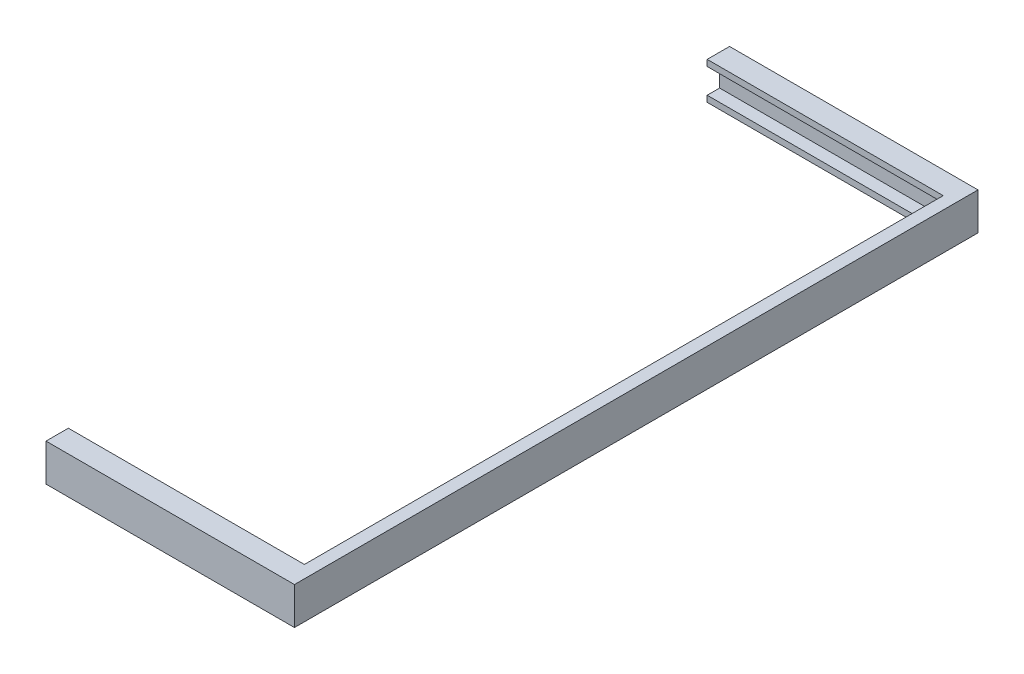
ISO-10303-21;
HEADER;
FILE_DESCRIPTION(('STEP AP214'),'2;1');
FILE_NAME('part.step','',(''),(''),'','','');
FILE_SCHEMA(('AUTOMOTIVE_DESIGN { 1 0 10303 214 1 1 1 1 }'));
ENDSEC;
DATA;
#1=APPLICATION_CONTEXT('core data for automotive mechanical design processes');
#2=APPLICATION_PROTOCOL_DEFINITION('international standard','automotive_design',2000,#1);
#3=PRODUCT_CONTEXT('',#1,'mechanical');
#4=PRODUCT('Part','Part','',(#3));
#5=PRODUCT_RELATED_PRODUCT_CATEGORY('part','',(#4));
#6=PRODUCT_DEFINITION_FORMATION('','',#4);
#7=PRODUCT_DEFINITION_CONTEXT('part definition',#1,'design');
#8=PRODUCT_DEFINITION('design','',#6,#7);
#9=PRODUCT_DEFINITION_SHAPE('','',#8);
#10=(LENGTH_UNIT() NAMED_UNIT(*) SI_UNIT(.MILLI.,.METRE.));
#11=(NAMED_UNIT(*) PLANE_ANGLE_UNIT() SI_UNIT($,.RADIAN.));
#12=(NAMED_UNIT(*) SI_UNIT($,.STERADIAN.) SOLID_ANGLE_UNIT());
#13=UNCERTAINTY_MEASURE_WITH_UNIT(LENGTH_MEASURE(1.E-05),#10,'distance_accuracy_value','');
#14=(GEOMETRIC_REPRESENTATION_CONTEXT(3) GLOBAL_UNCERTAINTY_ASSIGNED_CONTEXT((#13)) GLOBAL_UNIT_ASSIGNED_CONTEXT((#10,
#11,#12)) REPRESENTATION_CONTEXT('',''));
#15=CARTESIAN_POINT('',(0.,0.,0.));
#16=DIRECTION('',(0.,0.,1.));
#17=DIRECTION('',(1.,0.,0.));
#18=AXIS2_PLACEMENT_3D('',#15,#16,#17);
#19=CARTESIAN_POINT('',(95.,15.,271.12));
#20=DIRECTION('',(1.,0.,0.));
#21=DIRECTION('',(0.,0.,-1.));
#22=AXIS2_PLACEMENT_3D('',#19,#20,#21);
#23=PLANE('',#22);
#24=DIRECTION('',(0.,0.,-1.));
#25=VECTOR('',#24,1.);
#26=CARTESIAN_POINT('',(95.,2.5,271.12));
#27=LINE('',#26,#25);
#28=CARTESIAN_POINT('',(95.,2.5,271.12));
#29=VERTEX_POINT('',#28);
#30=CARTESIAN_POINT('',(95.,2.5,266.12));
#31=VERTEX_POINT('',#30);
#32=EDGE_CURVE('E187',#29,#31,#27,.T.);
#33=ORIENTED_EDGE('',*,*,#32,.F.);
#34=DIRECTION('',(0.,-1.,0.));
#35=VECTOR('',#34,1.);
#36=CARTESIAN_POINT('',(95.,15.,271.12));
#37=LINE('',#36,#35);
#38=CARTESIAN_POINT('',(95.,12.5,271.12));
#39=VERTEX_POINT('',#38);
#40=EDGE_CURVE('E234',#39,#29,#37,.T.);
#41=ORIENTED_EDGE('',*,*,#40,.F.);
#42=DIRECTION('',(0.,0.,-1.));
#43=VECTOR('',#42,1.);
#44=CARTESIAN_POINT('',(95.,12.5,271.12));
#45=LINE('',#44,#43);
#46=CARTESIAN_POINT('',(95.,12.5,266.12));
#47=VERTEX_POINT('',#46);
#48=EDGE_CURVE('E213',#39,#47,#45,.T.);
#49=ORIENTED_EDGE('',*,*,#48,.T.);
#50=DIRECTION('',(0.,1.,0.));
#51=VECTOR('',#50,1.);
#52=CARTESIAN_POINT('',(95.,15.,266.12));
#53=LINE('',#52,#51);
#54=CARTESIAN_POINT('',(95.,15.,266.12));
#55=VERTEX_POINT('',#54);
#56=EDGE_CURVE('E50',#47,#55,#53,.T.);
#57=ORIENTED_EDGE('',*,*,#56,.T.);
#58=DIRECTION('',(0.,0.,-1.));
#59=VECTOR('',#58,1.);
#60=CARTESIAN_POINT('',(95.,15.,271.12));
#61=LINE('',#60,#59);
#62=CARTESIAN_POINT('',(95.,15.,9.));
#63=VERTEX_POINT('',#62);
#64=EDGE_CURVE('E243',#55,#63,#61,.T.);
#65=ORIENTED_EDGE('',*,*,#64,.T.);
#66=DIRECTION('',(0.,1.,0.));
#67=VECTOR('',#66,1.);
#68=CARTESIAN_POINT('',(95.,0.,9.));
#69=LINE('',#68,#67);
#70=CARTESIAN_POINT('',(95.,12.5,9.));
#71=VERTEX_POINT('',#70);
#72=EDGE_CURVE('E249',#71,#63,#69,.T.);
#73=ORIENTED_EDGE('',*,*,#72,.F.);
#74=DIRECTION('',(0.,0.,-1.));
#75=VECTOR('',#74,1.);
#76=CARTESIAN_POINT('',(95.,12.5,9.));
#77=LINE('',#76,#75);
#78=CARTESIAN_POINT('',(95.,12.5,4.));
#79=VERTEX_POINT('',#78);
#80=EDGE_CURVE('E253',#71,#79,#77,.T.);
#81=ORIENTED_EDGE('',*,*,#80,.T.);
#82=DIRECTION('',(0.,-1.,0.));
#83=VECTOR('',#82,1.);
#84=CARTESIAN_POINT('',(95.,15.,4.));
#85=LINE('',#84,#83);
#86=CARTESIAN_POINT('',(95.,2.5,4.));
#87=VERTEX_POINT('',#86);
#88=EDGE_CURVE('E65',#79,#87,#85,.T.);
#89=ORIENTED_EDGE('',*,*,#88,.T.);
#90=DIRECTION('',(0.,0.,-1.));
#91=VECTOR('',#90,1.);
#92=CARTESIAN_POINT('',(95.,2.5,9.));
#93=LINE('',#92,#91);
#94=CARTESIAN_POINT('',(95.,2.5,9.));
#95=VERTEX_POINT('',#94);
#96=EDGE_CURVE('E246',#95,#87,#93,.T.);
#97=ORIENTED_EDGE('',*,*,#96,.F.);
#98=DIRECTION('',(0.,1.,0.));
#99=VECTOR('',#98,1.);
#100=CARTESIAN_POINT('',(95.,0.,9.));
#101=LINE('',#100,#99);
#102=CARTESIAN_POINT('',(95.,0.,9.));
#103=VERTEX_POINT('',#102);
#104=EDGE_CURVE('E325',#103,#95,#101,.T.);
#105=ORIENTED_EDGE('',*,*,#104,.F.);
#106=DIRECTION('',(0.,0.,-1.));
#107=VECTOR('',#106,1.);
#108=CARTESIAN_POINT('',(95.,0.,271.12));
#109=LINE('',#108,#107);
#110=CARTESIAN_POINT('',(95.,0.,266.12));
#111=VERTEX_POINT('',#110);
#112=EDGE_CURVE('E238',#111,#103,#109,.T.);
#113=ORIENTED_EDGE('',*,*,#112,.F.);
#114=DIRECTION('',(0.,1.,0.));
#115=VECTOR('',#114,1.);
#116=CARTESIAN_POINT('',(95.,15.,266.12));
#117=LINE('',#116,#115);
#118=EDGE_CURVE('E11',#111,#31,#117,.T.);
#119=ORIENTED_EDGE('',*,*,#118,.T.);
#120=EDGE_LOOP('',(#33,#41,#49,#57,#65,#73,#81,#89,#97,#105,#113,#119));
#121=FACE_BOUND('',#120,.T.);
#122=ADVANCED_FACE('F41',(#121),#23,.F.);
#123=CARTESIAN_POINT('',(0.,0.,271.12));
#124=DIRECTION('',(0.,0.,1.));
#125=DIRECTION('',(-1.,0.,0.));
#126=AXIS2_PLACEMENT_3D('',#123,#124,#125);
#127=PLANE('',#126);
#128=DIRECTION('',(1.,0.,0.));
#129=VECTOR('',#128,1.);
#130=CARTESIAN_POINT('',(0.,2.5,271.12));
#131=LINE('',#130,#129);
#132=CARTESIAN_POINT('',(0.,2.5,271.12));
#133=VERTEX_POINT('',#132);
#134=EDGE_CURVE('E191',#133,#29,#131,.T.);
#135=ORIENTED_EDGE('',*,*,#134,.F.);
#136=DIRECTION('',(0.,-1.,0.));
#137=VECTOR('',#136,1.);
#138=CARTESIAN_POINT('',(0.,0.,271.12));
#139=LINE('',#138,#137);
#140=CARTESIAN_POINT('',(0.,12.5,271.12));
#141=VERTEX_POINT('',#140);
#142=EDGE_CURVE('E170',#141,#133,#139,.T.);
#143=ORIENTED_EDGE('',*,*,#142,.F.);
#144=DIRECTION('',(1.,0.,0.));
#145=VECTOR('',#144,1.);
#146=CARTESIAN_POINT('',(0.,12.5,271.12));
#147=LINE('',#146,#145);
#148=EDGE_CURVE('E57',#141,#39,#147,.T.);
#149=ORIENTED_EDGE('',*,*,#148,.T.);
#150=ORIENTED_EDGE('',*,*,#40,.T.);
#151=EDGE_LOOP('',(#135,#143,#149,#150));
#152=FACE_BOUND('',#151,.T.);
#153=ADVANCED_FACE('F376',(#152),#127,.F.);
#154=CARTESIAN_POINT('',(0.,0.,4.));
#155=DIRECTION('',(0.,0.,-1.));
#156=DIRECTION('',(-1.,0.,0.));
#157=AXIS2_PLACEMENT_3D('',#154,#155,#156);
#158=PLANE('',#157);
#159=ORIENTED_EDGE('',*,*,#88,.F.);
#160=DIRECTION('',(1.,0.,0.));
#161=VECTOR('',#160,1.);
#162=CARTESIAN_POINT('',(0.,12.5,4.));
#163=LINE('',#162,#161);
#164=CARTESIAN_POINT('',(0.,12.5,4.));
#165=VERTEX_POINT('',#164);
#166=EDGE_CURVE('E276',#165,#79,#163,.T.);
#167=ORIENTED_EDGE('',*,*,#166,.F.);
#168=DIRECTION('',(0.,-1.,0.));
#169=VECTOR('',#168,1.);
#170=CARTESIAN_POINT('',(0.,0.,4.));
#171=LINE('',#170,#169);
#172=CARTESIAN_POINT('',(0.,2.5,4.));
#173=VERTEX_POINT('',#172);
#174=EDGE_CURVE('E295',#165,#173,#171,.T.);
#175=ORIENTED_EDGE('',*,*,#174,.T.);
#176=DIRECTION('',(1.,0.,0.));
#177=VECTOR('',#176,1.);
#178=CARTESIAN_POINT('',(0.,2.5,4.));
#179=LINE('',#178,#177);
#180=EDGE_CURVE('E257',#173,#87,#179,.T.);
#181=ORIENTED_EDGE('',*,*,#180,.T.);
#182=EDGE_LOOP('',(#159,#167,#175,#181));
#183=FACE_BOUND('',#182,.T.);
#184=ADVANCED_FACE('F349',(#183),#158,.F.);
#185=CARTESIAN_POINT('',(0.,12.5,9.));
#186=DIRECTION('',(0.,1.,0.));
#187=DIRECTION('',(0.,0.,1.));
#188=AXIS2_PLACEMENT_3D('',#185,#186,#187);
#189=PLANE('',#188);
#190=ORIENTED_EDGE('',*,*,#80,.F.);
#191=DIRECTION('',(1.,0.,0.));
#192=VECTOR('',#191,1.);
#193=CARTESIAN_POINT('',(0.,12.5,9.));
#194=LINE('',#193,#192);
#195=CARTESIAN_POINT('',(0.,12.5,9.));
#196=VERTEX_POINT('',#195);
#197=EDGE_CURVE('E281',#196,#71,#194,.T.);
#198=ORIENTED_EDGE('',*,*,#197,.F.);
#199=DIRECTION('',(0.,0.,-1.));
#200=VECTOR('',#199,1.);
#201=CARTESIAN_POINT('',(0.,12.5,9.));
#202=LINE('',#201,#200);
#203=EDGE_CURVE('E288',#196,#165,#202,.T.);
#204=ORIENTED_EDGE('',*,*,#203,.T.);
#205=ORIENTED_EDGE('',*,*,#166,.T.);
#206=EDGE_LOOP('',(#190,#198,#204,#205));
#207=FACE_BOUND('',#206,.T.);
#208=ADVANCED_FACE('F347',(#207),#189,.F.);
#209=CARTESIAN_POINT('',(0.,0.,9.));
#210=DIRECTION('',(0.,0.,1.));
#211=DIRECTION('',(1.,0.,0.));
#212=AXIS2_PLACEMENT_3D('',#209,#210,#211);
#213=PLANE('',#212);
#214=ORIENTED_EDGE('',*,*,#197,.T.);
#215=ORIENTED_EDGE('',*,*,#72,.T.);
#216=DIRECTION('',(-1.,0.,0.));
#217=VECTOR('',#216,1.);
#218=CARTESIAN_POINT('',(0.,15.,9.));
#219=LINE('',#218,#217);
#220=CARTESIAN_POINT('',(0.,15.,9.));
#221=VERTEX_POINT('',#220);
#222=EDGE_CURVE('E285',#63,#221,#219,.T.);
#223=ORIENTED_EDGE('',*,*,#222,.T.);
#224=DIRECTION('',(0.,-1.,0.));
#225=VECTOR('',#224,1.);
#226=CARTESIAN_POINT('',(0.,0.,9.));
#227=LINE('',#226,#225);
#228=EDGE_CURVE('E277',#221,#196,#227,.T.);
#229=ORIENTED_EDGE('',*,*,#228,.T.);
#230=EDGE_LOOP('',(#214,#215,#223,#229));
#231=FACE_BOUND('',#230,.T.);
#232=ADVANCED_FACE('F343',(#231),#213,.T.);
#233=CARTESIAN_POINT('',(0.,2.5,9.));
#234=DIRECTION('',(0.,1.,0.));
#235=DIRECTION('',(0.,0.,1.));
#236=AXIS2_PLACEMENT_3D('',#233,#234,#235);
#237=PLANE('',#236);
#238=DIRECTION('',(1.,0.,0.));
#239=VECTOR('',#238,1.);
#240=CARTESIAN_POINT('',(0.,2.5,9.));
#241=LINE('',#240,#239);
#242=CARTESIAN_POINT('',(0.,2.5,9.));
#243=VERTEX_POINT('',#242);
#244=EDGE_CURVE('E258',#243,#95,#241,.T.);
#245=ORIENTED_EDGE('',*,*,#244,.T.);
#246=ORIENTED_EDGE('',*,*,#96,.T.);
#247=ORIENTED_EDGE('',*,*,#180,.F.);
#248=DIRECTION('',(0.,0.,-1.));
#249=VECTOR('',#248,1.);
#250=CARTESIAN_POINT('',(0.,2.5,9.));
#251=LINE('',#250,#249);
#252=EDGE_CURVE('E270',#243,#173,#251,.T.);
#253=ORIENTED_EDGE('',*,*,#252,.F.);
#254=EDGE_LOOP('',(#245,#246,#247,#253));
#255=FACE_BOUND('',#254,.T.);
#256=ADVANCED_FACE('F355',(#255),#237,.T.);
#257=CARTESIAN_POINT('',(0.,0.,9.));
#258=DIRECTION('',(0.,0.,1.));
#259=DIRECTION('',(1.,0.,0.));
#260=AXIS2_PLACEMENT_3D('',#257,#258,#259);
#261=PLANE('',#260);
#262=DIRECTION('',(1.,0.,0.));
#263=VECTOR('',#262,1.);
#264=CARTESIAN_POINT('',(0.,0.,9.));
#265=LINE('',#264,#263);
#266=CARTESIAN_POINT('',(0.,0.,9.));
#267=VERTEX_POINT('',#266);
#268=EDGE_CURVE('E266',#267,#103,#265,.T.);
#269=ORIENTED_EDGE('',*,*,#268,.T.);
#270=ORIENTED_EDGE('',*,*,#104,.T.);
#271=ORIENTED_EDGE('',*,*,#244,.F.);
#272=DIRECTION('',(0.,-1.,0.));
#273=VECTOR('',#272,1.);
#274=CARTESIAN_POINT('',(0.,0.,9.));
#275=LINE('',#274,#273);
#276=EDGE_CURVE('E262',#243,#267,#275,.T.);
#277=ORIENTED_EDGE('',*,*,#276,.T.);
#278=EDGE_LOOP('',(#269,#270,#271,#277));
#279=FACE_BOUND('',#278,.T.);
#280=ADVANCED_FACE('F358',(#279),#261,.T.);
#281=CARTESIAN_POINT('',(0.,0.,4.));
#282=DIRECTION('',(1.,0.,0.));
#283=DIRECTION('',(0.,0.,-1.));
#284=AXIS2_PLACEMENT_3D('',#281,#282,#283);
#285=PLANE('',#284);
#286=DIRECTION('',(0.,-1.,0.));
#287=VECTOR('',#286,1.);
#288=CARTESIAN_POINT('',(0.,0.,0.));
#289=LINE('',#288,#287);
#290=CARTESIAN_POINT('',(0.,15.,0.));
#291=VERTEX_POINT('',#290);
#292=CARTESIAN_POINT('',(0.,0.,0.));
#293=VERTEX_POINT('',#292);
#294=EDGE_CURVE('E294',#291,#293,#289,.T.);
#295=ORIENTED_EDGE('',*,*,#294,.T.);
#296=DIRECTION('',(0.,0.,-1.));
#297=VECTOR('',#296,1.);
#298=CARTESIAN_POINT('',(0.,0.,4.));
#299=LINE('',#298,#297);
#300=EDGE_CURVE('E321',#267,#293,#299,.T.);
#301=ORIENTED_EDGE('',*,*,#300,.F.);
#302=ORIENTED_EDGE('',*,*,#276,.F.);
#303=ORIENTED_EDGE('',*,*,#252,.T.);
#304=ORIENTED_EDGE('',*,*,#174,.F.);
#305=ORIENTED_EDGE('',*,*,#203,.F.);
#306=ORIENTED_EDGE('',*,*,#228,.F.);
#307=DIRECTION('',(0.,0.,-1.));
#308=VECTOR('',#307,1.);
#309=CARTESIAN_POINT('',(0.,15.,4.));
#310=LINE('',#309,#308);
#311=EDGE_CURVE('E298',#221,#291,#310,.T.);
#312=ORIENTED_EDGE('',*,*,#311,.T.);
#313=EDGE_LOOP('',(#295,#301,#302,#303,#304,#305,#306,#312));
#314=FACE_BOUND('',#313,.T.);
#315=ADVANCED_FACE('F43',(#314),#285,.F.);
#316=CARTESIAN_POINT('',(0.,0.,4.));
#317=DIRECTION('',(0.,1.,0.));
#318=DIRECTION('',(0.,0.,1.));
#319=AXIS2_PLACEMENT_3D('',#316,#317,#318);
#320=PLANE('',#319);
#321=DIRECTION('',(1.,0.,0.));
#322=VECTOR('',#321,1.);
#323=CARTESIAN_POINT('',(0.,0.,0.));
#324=LINE('',#323,#322);
#325=CARTESIAN_POINT('',(100.,0.,0.));
#326=VERTEX_POINT('',#325);
#327=EDGE_CURVE('E303',#293,#326,#324,.T.);
#328=ORIENTED_EDGE('',*,*,#327,.T.);
#329=DIRECTION('',(0.,0.,-1.));
#330=VECTOR('',#329,1.);
#331=CARTESIAN_POINT('',(100.,0.,4.));
#332=LINE('',#331,#330);
#333=CARTESIAN_POINT('',(100.,0.,275.12));
#334=VERTEX_POINT('',#333);
#335=EDGE_CURVE('E318',#334,#326,#332,.T.);
#336=ORIENTED_EDGE('',*,*,#335,.F.);
#337=DIRECTION('',(1.,0.,0.));
#338=VECTOR('',#337,1.);
#339=CARTESIAN_POINT('',(0.,0.,275.12));
#340=LINE('',#339,#338);
#341=CARTESIAN_POINT('',(0.,0.,275.12));
#342=VERTEX_POINT('',#341);
#343=EDGE_CURVE('E163',#342,#334,#340,.T.);
#344=ORIENTED_EDGE('',*,*,#343,.F.);
#345=DIRECTION('',(0.,0.,1.));
#346=VECTOR('',#345,1.);
#347=CARTESIAN_POINT('',(0.,0.,271.12));
#348=LINE('',#347,#346);
#349=CARTESIAN_POINT('',(0.,0.,266.12));
#350=VERTEX_POINT('',#349);
#351=EDGE_CURVE('E156',#350,#342,#348,.T.);
#352=ORIENTED_EDGE('',*,*,#351,.F.);
#353=DIRECTION('',(1.,0.,0.));
#354=VECTOR('',#353,1.);
#355=CARTESIAN_POINT('',(0.,0.,266.12));
#356=LINE('',#355,#354);
#357=EDGE_CURVE('E160',#350,#111,#356,.T.);
#358=ORIENTED_EDGE('',*,*,#357,.T.);
#359=ORIENTED_EDGE('',*,*,#112,.T.);
#360=ORIENTED_EDGE('',*,*,#268,.F.);
#361=ORIENTED_EDGE('',*,*,#300,.T.);
#362=EDGE_LOOP('',(#328,#336,#344,#352,#358,#359,#360,#361));
#363=FACE_BOUND('',#362,.T.);
#364=ADVANCED_FACE('F159',(#363),#320,.F.);
#365=CARTESIAN_POINT('',(100.,15.,4.));
#366=DIRECTION('',(-1.,0.,0.));
#367=DIRECTION('',(0.,0.,1.));
#368=AXIS2_PLACEMENT_3D('',#365,#366,#367);
#369=PLANE('',#368);
#370=ORIENTED_EDGE('',*,*,#335,.T.);
#371=DIRECTION('',(0.,1.,0.));
#372=VECTOR('',#371,1.);
#373=CARTESIAN_POINT('',(100.,15.,0.));
#374=LINE('',#373,#372);
#375=CARTESIAN_POINT('',(100.,15.,0.));
#376=VERTEX_POINT('',#375);
#377=EDGE_CURVE('E306',#326,#376,#374,.T.);
#378=ORIENTED_EDGE('',*,*,#377,.T.);
#379=DIRECTION('',(0.,0.,-1.));
#380=VECTOR('',#379,1.);
#381=CARTESIAN_POINT('',(100.,15.,4.));
#382=LINE('',#381,#380);
#383=CARTESIAN_POINT('',(100.,15.,275.12));
#384=VERTEX_POINT('',#383);
#385=EDGE_CURVE('E315',#384,#376,#382,.T.);
#386=ORIENTED_EDGE('',*,*,#385,.F.);
#387=DIRECTION('',(0.,1.,0.));
#388=VECTOR('',#387,1.);
#389=CARTESIAN_POINT('',(100.,15.,275.12));
#390=LINE('',#389,#388);
#391=EDGE_CURVE('E226',#334,#384,#390,.T.);
#392=ORIENTED_EDGE('',*,*,#391,.F.);
#393=EDGE_LOOP('',(#370,#378,#386,#392));
#394=FACE_BOUND('',#393,.T.);
#395=ADVANCED_FACE('F366',(#394),#369,.F.);
#396=CARTESIAN_POINT('',(0.,15.,4.));
#397=DIRECTION('',(0.,-1.,0.));
#398=DIRECTION('',(0.,0.,-1.));
#399=AXIS2_PLACEMENT_3D('',#396,#397,#398);
#400=PLANE('',#399);
#401=ORIENTED_EDGE('',*,*,#64,.F.);
#402=DIRECTION('',(-1.,0.,0.));
#403=VECTOR('',#402,1.);
#404=CARTESIAN_POINT('',(0.,15.,266.12));
#405=LINE('',#404,#403);
#406=CARTESIAN_POINT('',(0.,15.,266.12));
#407=VERTEX_POINT('',#406);
#408=EDGE_CURVE('E200',#55,#407,#405,.T.);
#409=ORIENTED_EDGE('',*,*,#408,.T.);
#410=DIRECTION('',(0.,0.,1.));
#411=VECTOR('',#410,1.);
#412=CARTESIAN_POINT('',(0.,15.,271.12));
#413=LINE('',#412,#411);
#414=CARTESIAN_POINT('',(0.,15.,275.12));
#415=VERTEX_POINT('',#414);
#416=EDGE_CURVE('E169',#407,#415,#413,.T.);
#417=ORIENTED_EDGE('',*,*,#416,.T.);
#418=DIRECTION('',(-1.,0.,0.));
#419=VECTOR('',#418,1.);
#420=CARTESIAN_POINT('',(0.,15.,275.12));
#421=LINE('',#420,#419);
#422=EDGE_CURVE('E222',#384,#415,#421,.T.);
#423=ORIENTED_EDGE('',*,*,#422,.F.);
#424=ORIENTED_EDGE('',*,*,#385,.T.);
#425=DIRECTION('',(-1.,0.,0.));
#426=VECTOR('',#425,1.);
#427=CARTESIAN_POINT('',(0.,15.,0.));
#428=LINE('',#427,#426);
#429=EDGE_CURVE('E299',#376,#291,#428,.T.);
#430=ORIENTED_EDGE('',*,*,#429,.T.);
#431=ORIENTED_EDGE('',*,*,#311,.F.);
#432=ORIENTED_EDGE('',*,*,#222,.F.);
#433=EDGE_LOOP('',(#401,#409,#417,#423,#424,#430,#431,#432));
#434=FACE_BOUND('',#433,.T.);
#435=ADVANCED_FACE('F338',(#434),#400,.F.);
#436=CARTESIAN_POINT('',(0.,0.,0.));
#437=DIRECTION('',(0.,0.,-1.));
#438=DIRECTION('',(-1.,0.,0.));
#439=AXIS2_PLACEMENT_3D('',#436,#437,#438);
#440=PLANE('',#439);
#441=ORIENTED_EDGE('',*,*,#294,.F.);
#442=ORIENTED_EDGE('',*,*,#429,.F.);
#443=ORIENTED_EDGE('',*,*,#377,.F.);
#444=ORIENTED_EDGE('',*,*,#327,.F.);
#445=EDGE_LOOP('',(#441,#442,#443,#444));
#446=FACE_BOUND('',#445,.T.);
#447=ADVANCED_FACE('F364',(#446),#440,.T.);
#448=CARTESIAN_POINT('',(0.,0.,271.12));
#449=DIRECTION('',(-1.,0.,0.));
#450=DIRECTION('',(0.,0.,1.));
#451=AXIS2_PLACEMENT_3D('',#448,#449,#450);
#452=PLANE('',#451);
#453=DIRECTION('',(0.,-1.,0.));
#454=VECTOR('',#453,1.);
#455=CARTESIAN_POINT('',(0.,0.,275.12));
#456=LINE('',#455,#454);
#457=EDGE_CURVE('E217',#415,#342,#456,.T.);
#458=ORIENTED_EDGE('',*,*,#457,.F.);
#459=ORIENTED_EDGE('',*,*,#416,.F.);
#460=DIRECTION('',(0.,-1.,0.));
#461=VECTOR('',#460,1.);
#462=CARTESIAN_POINT('',(0.,0.,266.12));
#463=LINE('',#462,#461);
#464=CARTESIAN_POINT('',(0.,12.5,266.12));
#465=VERTEX_POINT('',#464);
#466=EDGE_CURVE('E196',#407,#465,#463,.T.);
#467=ORIENTED_EDGE('',*,*,#466,.T.);
#468=DIRECTION('',(0.,0.,1.));
#469=VECTOR('',#468,1.);
#470=CARTESIAN_POINT('',(0.,12.5,266.12));
#471=LINE('',#470,#469);
#472=EDGE_CURVE('E208',#465,#141,#471,.T.);
#473=ORIENTED_EDGE('',*,*,#472,.T.);
#474=ORIENTED_EDGE('',*,*,#142,.T.);
#475=DIRECTION('',(0.,0.,1.));
#476=VECTOR('',#475,1.);
#477=CARTESIAN_POINT('',(0.,2.5,266.12));
#478=LINE('',#477,#476);
#479=CARTESIAN_POINT('',(0.,2.5,266.12));
#480=VERTEX_POINT('',#479);
#481=EDGE_CURVE('E182',#480,#133,#478,.T.);
#482=ORIENTED_EDGE('',*,*,#481,.F.);
#483=DIRECTION('',(0.,-1.,0.));
#484=VECTOR('',#483,1.);
#485=CARTESIAN_POINT('',(0.,0.,266.12));
#486=LINE('',#485,#484);
#487=EDGE_CURVE('E176',#480,#350,#486,.T.);
#488=ORIENTED_EDGE('',*,*,#487,.T.);
#489=ORIENTED_EDGE('',*,*,#351,.T.);
#490=EDGE_LOOP('',(#458,#459,#467,#473,#474,#482,#488,#489));
#491=FACE_BOUND('',#490,.T.);
#492=ADVANCED_FACE('F180',(#491),#452,.T.);
#493=CARTESIAN_POINT('',(0.,0.,275.12));
#494=DIRECTION('',(0.,0.,1.));
#495=DIRECTION('',(-1.,0.,0.));
#496=AXIS2_PLACEMENT_3D('',#493,#494,#495);
#497=PLANE('',#496);
#498=ORIENTED_EDGE('',*,*,#457,.T.);
#499=ORIENTED_EDGE('',*,*,#343,.T.);
#500=ORIENTED_EDGE('',*,*,#391,.T.);
#501=ORIENTED_EDGE('',*,*,#422,.T.);
#502=EDGE_LOOP('',(#498,#499,#500,#501));
#503=FACE_BOUND('',#502,.T.);
#504=ADVANCED_FACE('F370',(#503),#497,.T.);
#505=CARTESIAN_POINT('',(0.,0.,266.12));
#506=DIRECTION('',(0.,0.,-1.));
#507=DIRECTION('',(1.,0.,0.));
#508=AXIS2_PLACEMENT_3D('',#505,#506,#507);
#509=PLANE('',#508);
#510=ORIENTED_EDGE('',*,*,#56,.F.);
#511=DIRECTION('',(1.,0.,0.));
#512=VECTOR('',#511,1.);
#513=CARTESIAN_POINT('',(0.,12.5,266.12));
#514=LINE('',#513,#512);
#515=EDGE_CURVE('E204',#465,#47,#514,.T.);
#516=ORIENTED_EDGE('',*,*,#515,.F.);
#517=ORIENTED_EDGE('',*,*,#466,.F.);
#518=ORIENTED_EDGE('',*,*,#408,.F.);
#519=EDGE_LOOP('',(#510,#516,#517,#518));
#520=FACE_BOUND('',#519,.T.);
#521=ADVANCED_FACE('F372',(#520),#509,.T.);
#522=CARTESIAN_POINT('',(0.,12.5,266.12));
#523=DIRECTION('',(0.,-1.,0.));
#524=DIRECTION('',(0.,0.,-1.));
#525=AXIS2_PLACEMENT_3D('',#522,#523,#524);
#526=PLANE('',#525);
#527=ORIENTED_EDGE('',*,*,#48,.F.);
#528=ORIENTED_EDGE('',*,*,#148,.F.);
#529=ORIENTED_EDGE('',*,*,#472,.F.);
#530=ORIENTED_EDGE('',*,*,#515,.T.);
#531=EDGE_LOOP('',(#527,#528,#529,#530));
#532=FACE_BOUND('',#531,.T.);
#533=ADVANCED_FACE('F373',(#532),#526,.T.);
#534=CARTESIAN_POINT('',(0.,0.,266.12));
#535=DIRECTION('',(0.,0.,-1.));
#536=DIRECTION('',(1.,0.,0.));
#537=AXIS2_PLACEMENT_3D('',#534,#535,#536);
#538=PLANE('',#537);
#539=ORIENTED_EDGE('',*,*,#118,.F.);
#540=ORIENTED_EDGE('',*,*,#357,.F.);
#541=ORIENTED_EDGE('',*,*,#487,.F.);
#542=DIRECTION('',(1.,0.,0.));
#543=VECTOR('',#542,1.);
#544=CARTESIAN_POINT('',(0.,2.5,266.12));
#545=LINE('',#544,#543);
#546=EDGE_CURVE('E178',#480,#31,#545,.T.);
#547=ORIENTED_EDGE('',*,*,#546,.T.);
#548=EDGE_LOOP('',(#539,#540,#541,#547));
#549=FACE_BOUND('',#548,.T.);
#550=ADVANCED_FACE('F174',(#549),#538,.T.);
#551=CARTESIAN_POINT('',(0.,2.5,266.12));
#552=DIRECTION('',(0.,-1.,0.));
#553=DIRECTION('',(0.,0.,-1.));
#554=AXIS2_PLACEMENT_3D('',#551,#552,#553);
#555=PLANE('',#554);
#556=ORIENTED_EDGE('',*,*,#134,.T.);
#557=ORIENTED_EDGE('',*,*,#32,.T.);
#558=ORIENTED_EDGE('',*,*,#546,.F.);
#559=ORIENTED_EDGE('',*,*,#481,.T.);
#560=EDGE_LOOP('',(#556,#557,#558,#559));
#561=FACE_BOUND('',#560,.T.);
#562=ADVANCED_FACE('F378',(#561),#555,.F.);
#563=CLOSED_SHELL('',(#122,#153,#184,#208,#232,#256,#280,#315,#364,#395,#435,#447,#492,#504,
#521,#533,#550,#562));
#564=MANIFOLD_SOLID_BREP('B2',#563);
#565=ADVANCED_BREP_SHAPE_REPRESENTATION('',(#18,#564),#14);
#566=SHAPE_DEFINITION_REPRESENTATION(#9,#565);
ENDSEC;
END-ISO-10303-21;
